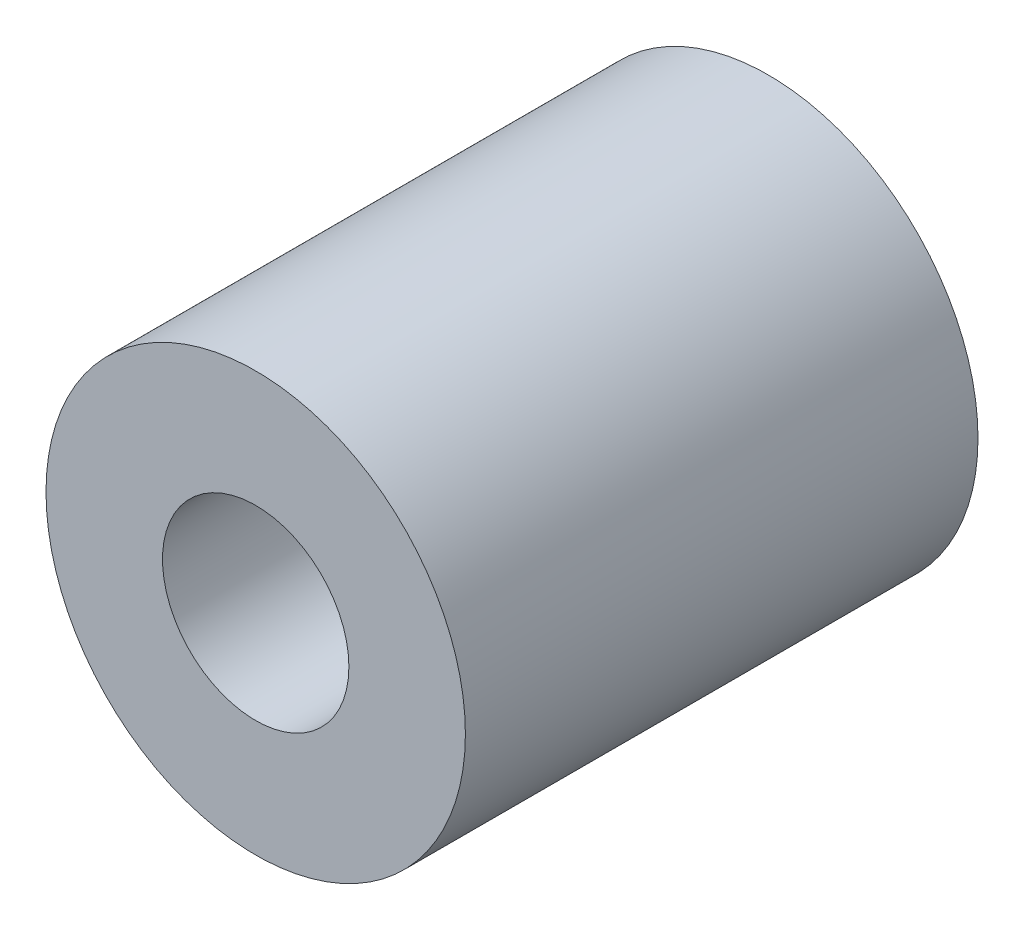
ISO-10303-21;
HEADER;
FILE_DESCRIPTION(('STEP AP214'),'2;1');
FILE_NAME('part.step','',(''),(''),'','','');
FILE_SCHEMA(('AUTOMOTIVE_DESIGN { 1 0 10303 214 1 1 1 1 }'));
ENDSEC;
DATA;
#1=APPLICATION_CONTEXT('core data for automotive mechanical design processes');
#2=APPLICATION_PROTOCOL_DEFINITION('international standard','automotive_design',2000,#1);
#3=PRODUCT_CONTEXT('',#1,'mechanical');
#4=PRODUCT('Part','Part','',(#3));
#5=PRODUCT_RELATED_PRODUCT_CATEGORY('part','',(#4));
#6=PRODUCT_DEFINITION_FORMATION('','',#4);
#7=PRODUCT_DEFINITION_CONTEXT('part definition',#1,'design');
#8=PRODUCT_DEFINITION('design','',#6,#7);
#9=PRODUCT_DEFINITION_SHAPE('','',#8);
#10=(LENGTH_UNIT() NAMED_UNIT(*) SI_UNIT(.MILLI.,.METRE.));
#11=(NAMED_UNIT(*) PLANE_ANGLE_UNIT() SI_UNIT($,.RADIAN.));
#12=(NAMED_UNIT(*) SI_UNIT($,.STERADIAN.) SOLID_ANGLE_UNIT());
#13=UNCERTAINTY_MEASURE_WITH_UNIT(LENGTH_MEASURE(1.E-05),#10,'distance_accuracy_value','');
#14=(GEOMETRIC_REPRESENTATION_CONTEXT(3) GLOBAL_UNCERTAINTY_ASSIGNED_CONTEXT((#13)) GLOBAL_UNIT_ASSIGNED_CONTEXT((#10,
#11,#12)) REPRESENTATION_CONTEXT('',''));
#15=CARTESIAN_POINT('',(0.,0.,0.));
#16=DIRECTION('',(0.,0.,1.));
#17=DIRECTION('',(1.,0.,0.));
#18=AXIS2_PLACEMENT_3D('',#15,#16,#17);
#19=CARTESIAN_POINT('',(0.,0.,110.));
#20=DIRECTION('',(0.,0.,1.));
#21=DIRECTION('',(1.,0.,0.));
#22=AXIS2_PLACEMENT_3D('',#19,#20,#21);
#23=PLANE('',#22);
#24=CARTESIAN_POINT('',(0.,0.,110.));
#25=DIRECTION('',(0.,0.,1.));
#26=DIRECTION('',(1.,0.,0.));
#27=AXIS2_PLACEMENT_3D('',#24,#25,#26);
#28=CIRCLE('',#27,45.);
#29=CARTESIAN_POINT('',(45.,0.,110.));
#30=VERTEX_POINT('',#29);
#31=EDGE_CURVE('E10',#30,#30,#28,.T.);
#32=ORIENTED_EDGE('',*,*,#31,.T.);
#33=EDGE_LOOP('',(#32));
#34=FACE_BOUND('',#33,.T.);
#35=CARTESIAN_POINT('',(0.,0.,110.));
#36=DIRECTION('',(0.,0.,1.));
#37=DIRECTION('',(1.,0.,0.));
#38=AXIS2_PLACEMENT_3D('',#35,#36,#37);
#39=CIRCLE('',#38,20.);
#40=CARTESIAN_POINT('',(20.,0.,110.));
#41=VERTEX_POINT('',#40);
#42=EDGE_CURVE('E48',#41,#41,#39,.T.);
#43=ORIENTED_EDGE('',*,*,#42,.F.);
#44=EDGE_LOOP('',(#43));
#45=FACE_BOUND('',#44,.T.);
#46=ADVANCED_FACE('F37',(#34,#45),#23,.T.);
#47=CARTESIAN_POINT('',(0.,0.,0.));
#48=DIRECTION('',(0.,0.,1.));
#49=DIRECTION('',(1.,0.,0.));
#50=AXIS2_PLACEMENT_3D('',#47,#48,#49);
#51=PLANE('',#50);
#52=CARTESIAN_POINT('',(0.,0.,0.));
#53=DIRECTION('',(0.,0.,1.));
#54=DIRECTION('',(1.,0.,0.));
#55=AXIS2_PLACEMENT_3D('',#52,#53,#54);
#56=CIRCLE('',#55,45.);
#57=CARTESIAN_POINT('',(45.,0.,0.));
#58=VERTEX_POINT('',#57);
#59=EDGE_CURVE('E41',#58,#58,#56,.T.);
#60=ORIENTED_EDGE('',*,*,#59,.F.);
#61=EDGE_LOOP('',(#60));
#62=FACE_BOUND('',#61,.T.);
#63=CARTESIAN_POINT('',(0.,0.,0.));
#64=DIRECTION('',(0.,0.,1.));
#65=DIRECTION('',(1.,0.,0.));
#66=AXIS2_PLACEMENT_3D('',#63,#64,#65);
#67=CIRCLE('',#66,20.);
#68=CARTESIAN_POINT('',(20.,0.,0.));
#69=VERTEX_POINT('',#68);
#70=EDGE_CURVE('E50',#69,#69,#67,.T.);
#71=ORIENTED_EDGE('',*,*,#70,.T.);
#72=EDGE_LOOP('',(#71));
#73=FACE_BOUND('',#72,.T.);
#74=ADVANCED_FACE('F60',(#62,#73),#51,.F.);
#75=CARTESIAN_POINT('',(0.,0.,110.));
#76=DIRECTION('',(0.,0.,-1.));
#77=DIRECTION('',(-1.,0.,0.));
#78=AXIS2_PLACEMENT_3D('',#75,#76,#77);
#79=CYLINDRICAL_SURFACE('',#78,45.);
#80=ORIENTED_EDGE('',*,*,#31,.F.);
#81=EDGE_LOOP('',(#80));
#82=FACE_BOUND('',#81,.T.);
#83=ORIENTED_EDGE('',*,*,#59,.T.);
#84=EDGE_LOOP('',(#83));
#85=FACE_BOUND('',#84,.T.);
#86=ADVANCED_FACE('F39',(#82,#85),#79,.T.);
#87=CARTESIAN_POINT('',(0.,0.,110.));
#88=DIRECTION('',(0.,0.,-1.));
#89=DIRECTION('',(-1.,0.,0.));
#90=AXIS2_PLACEMENT_3D('',#87,#88,#89);
#91=CYLINDRICAL_SURFACE('',#90,20.);
#92=ORIENTED_EDGE('',*,*,#42,.T.);
#93=EDGE_LOOP('',(#92));
#94=FACE_BOUND('',#93,.T.);
#95=ORIENTED_EDGE('',*,*,#70,.F.);
#96=EDGE_LOOP('',(#95));
#97=FACE_BOUND('',#96,.T.);
#98=ADVANCED_FACE('F56',(#94,#97),#91,.F.);
#99=CLOSED_SHELL('',(#46,#74,#86,#98));
#100=MANIFOLD_SOLID_BREP('B2',#99);
#101=ADVANCED_BREP_SHAPE_REPRESENTATION('',(#18,#100),#14);
#102=SHAPE_DEFINITION_REPRESENTATION(#9,#101);
ENDSEC;
END-ISO-10303-21;
